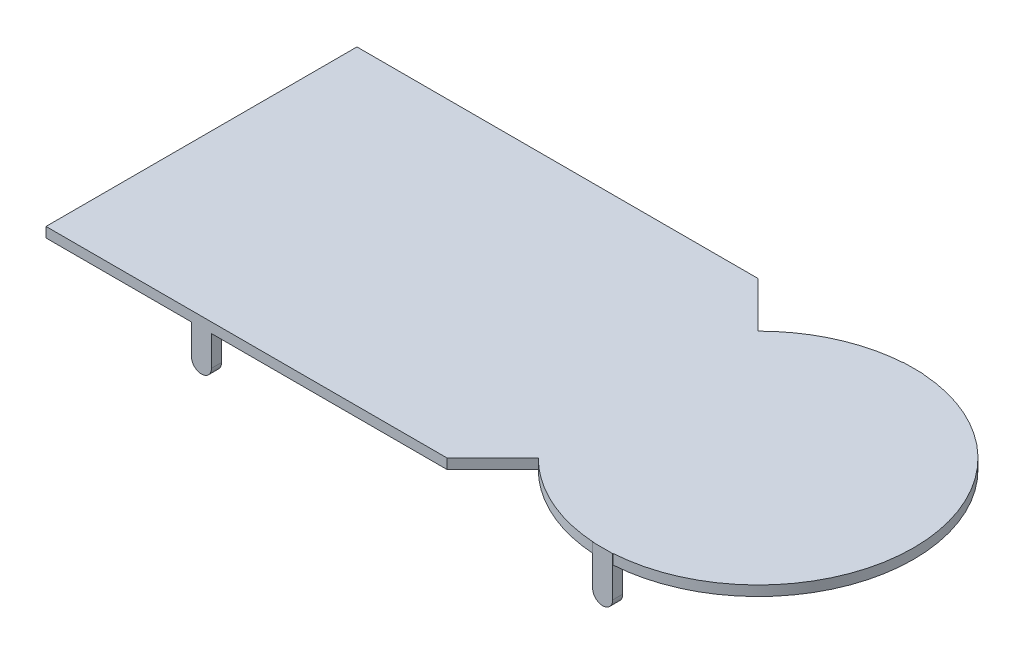
ISO-10303-21;
HEADER;
FILE_DESCRIPTION(('STEP AP214'),'2;1');
FILE_NAME('part.step','',(''),(''),'','','');
FILE_SCHEMA(('AUTOMOTIVE_DESIGN { 1 0 10303 214 1 1 1 1 }'));
ENDSEC;
DATA;
#1=APPLICATION_CONTEXT('core data for automotive mechanical design processes');
#2=APPLICATION_PROTOCOL_DEFINITION('international standard','automotive_design',2000,#1);
#3=PRODUCT_CONTEXT('',#1,'mechanical');
#4=PRODUCT('Part','Part','',(#3));
#5=PRODUCT_RELATED_PRODUCT_CATEGORY('part','',(#4));
#6=PRODUCT_DEFINITION_FORMATION('','',#4);
#7=PRODUCT_DEFINITION_CONTEXT('part definition',#1,'design');
#8=PRODUCT_DEFINITION('design','',#6,#7);
#9=PRODUCT_DEFINITION_SHAPE('','',#8);
#10=(LENGTH_UNIT() NAMED_UNIT(*) SI_UNIT(.MILLI.,.METRE.));
#11=(NAMED_UNIT(*) PLANE_ANGLE_UNIT() SI_UNIT($,.RADIAN.));
#12=(NAMED_UNIT(*) SI_UNIT($,.STERADIAN.) SOLID_ANGLE_UNIT());
#13=UNCERTAINTY_MEASURE_WITH_UNIT(LENGTH_MEASURE(1.E-05),#10,'distance_accuracy_value','');
#14=(GEOMETRIC_REPRESENTATION_CONTEXT(3) GLOBAL_UNCERTAINTY_ASSIGNED_CONTEXT((#13)) GLOBAL_UNIT_ASSIGNED_CONTEXT((#10,
#11,#12)) REPRESENTATION_CONTEXT('',''));
#15=CARTESIAN_POINT('',(0.,0.,0.));
#16=DIRECTION('',(0.,0.,1.));
#17=DIRECTION('',(1.,0.,0.));
#18=AXIS2_PLACEMENT_3D('',#15,#16,#17);
#19=CARTESIAN_POINT('',(-35.,10.,-155.));
#20=DIRECTION('',(1.,0.,0.));
#21=DIRECTION('',(0.,0.,-1.));
#22=AXIS2_PLACEMENT_3D('',#19,#20,#21);
#23=PLANE('',#22);
#24=DIRECTION('',(0.,-1.,0.));
#25=VECTOR('',#24,1.);
#26=CARTESIAN_POINT('',(-35.,10.,145.));
#27=LINE('',#26,#25);
#28=CARTESIAN_POINT('',(-34.9999999999998,0.,145.));
#29=VERTEX_POINT('',#28);
#30=CARTESIAN_POINT('',(-35.,-30.,145.));
#31=VERTEX_POINT('',#30);
#32=EDGE_CURVE('E273',#29,#31,#27,.T.);
#33=ORIENTED_EDGE('',*,*,#32,.F.);
#34=DIRECTION('',(0.,0.,-1.));
#35=VECTOR('',#34,1.);
#36=CARTESIAN_POINT('',(-35.,0.,0.));
#37=LINE('',#36,#35);
#38=CARTESIAN_POINT('',(-35.,0.,155.));
#39=VERTEX_POINT('',#38);
#40=EDGE_CURVE('E218',#39,#29,#37,.T.);
#41=ORIENTED_EDGE('',*,*,#40,.F.);
#42=DIRECTION('',(0.,1.,0.));
#43=VECTOR('',#42,1.);
#44=CARTESIAN_POINT('',(-35.,10.,155.));
#45=LINE('',#44,#43);
#46=CARTESIAN_POINT('',(-35.,-30.,155.));
#47=VERTEX_POINT('',#46);
#48=EDGE_CURVE('E315',#47,#39,#45,.T.);
#49=ORIENTED_EDGE('',*,*,#48,.F.);
#50=DIRECTION('',(0.,0.,1.));
#51=VECTOR('',#50,1.);
#52=CARTESIAN_POINT('',(-35.,-30.,-155.));
#53=LINE('',#52,#51);
#54=EDGE_CURVE('E334',#31,#47,#53,.T.);
#55=ORIENTED_EDGE('',*,*,#54,.F.);
#56=EDGE_LOOP('',(#33,#41,#49,#55));
#57=FACE_BOUND('',#56,.T.);
#58=ADVANCED_FACE('F37',(#57),#23,.T.);
#59=CARTESIAN_POINT('',(-55.,10.,-155.));
#60=DIRECTION('',(-1.,0.,0.));
#61=DIRECTION('',(0.,0.,1.));
#62=AXIS2_PLACEMENT_3D('',#59,#60,#61);
#63=PLANE('',#62);
#64=DIRECTION('',(0.,1.,0.));
#65=VECTOR('',#64,1.);
#66=CARTESIAN_POINT('',(-55.,-40.,145.));
#67=LINE('',#66,#65);
#68=CARTESIAN_POINT('',(-55.,-30.,145.));
#69=VERTEX_POINT('',#68);
#70=CARTESIAN_POINT('',(-55.,0.,145.));
#71=VERTEX_POINT('',#70);
#72=EDGE_CURVE('E225',#69,#71,#67,.T.);
#73=ORIENTED_EDGE('',*,*,#72,.F.);
#74=DIRECTION('',(0.,0.,1.));
#75=VECTOR('',#74,1.);
#76=CARTESIAN_POINT('',(-55.,-30.,-155.));
#77=LINE('',#76,#75);
#78=CARTESIAN_POINT('',(-55.,-30.,155.));
#79=VERTEX_POINT('',#78);
#80=EDGE_CURVE('E325',#69,#79,#77,.T.);
#81=ORIENTED_EDGE('',*,*,#80,.T.);
#82=DIRECTION('',(0.,-1.,0.));
#83=VECTOR('',#82,1.);
#84=CARTESIAN_POINT('',(-55.,10.,155.));
#85=LINE('',#84,#83);
#86=CARTESIAN_POINT('',(-55.,0.,155.));
#87=VERTEX_POINT('',#86);
#88=EDGE_CURVE('E234',#87,#79,#85,.T.);
#89=ORIENTED_EDGE('',*,*,#88,.F.);
#90=DIRECTION('',(0.,0.,1.));
#91=VECTOR('',#90,1.);
#92=CARTESIAN_POINT('',(-55.,0.,0.));
#93=LINE('',#92,#91);
#94=EDGE_CURVE('E214',#71,#87,#93,.T.);
#95=ORIENTED_EDGE('',*,*,#94,.F.);
#96=EDGE_LOOP('',(#73,#81,#89,#95));
#97=FACE_BOUND('',#96,.T.);
#98=ADVANCED_FACE('F232',(#97),#63,.T.);
#99=CARTESIAN_POINT('',(-45.,-30.,-155.));
#100=DIRECTION('',(0.,0.,1.));
#101=DIRECTION('',(1.,0.,0.));
#102=AXIS2_PLACEMENT_3D('',#99,#100,#101);
#103=CYLINDRICAL_SURFACE('',#102,10.);
#104=ORIENTED_EDGE('',*,*,#80,.F.);
#105=CARTESIAN_POINT('',(-45.,-30.,145.));
#106=DIRECTION('',(0.,0.,1.));
#107=DIRECTION('',(1.,0.,0.));
#108=AXIS2_PLACEMENT_3D('',#105,#106,#107);
#109=CIRCLE('',#108,10.);
#110=EDGE_CURVE('E228',#31,#69,#109,.F.);
#111=ORIENTED_EDGE('',*,*,#110,.F.);
#112=ORIENTED_EDGE('',*,*,#54,.T.);
#113=CARTESIAN_POINT('',(-45.,-30.,155.));
#114=DIRECTION('',(0.,0.,1.));
#115=DIRECTION('',(1.,0.,0.));
#116=AXIS2_PLACEMENT_3D('',#113,#114,#115);
#117=CIRCLE('',#116,10.);
#118=EDGE_CURVE('E320',#79,#47,#117,.T.);
#119=ORIENTED_EDGE('',*,*,#118,.F.);
#120=EDGE_LOOP('',(#104,#111,#112,#119));
#121=FACE_BOUND('',#120,.T.);
#122=ADVANCED_FACE('F468',(#121),#103,.T.);
#123=CARTESIAN_POINT('',(364.999999999997,10.,-155.));
#124=DIRECTION('',(1.,0.,0.));
#125=DIRECTION('',(0.,1.,0.));
#126=AXIS2_PLACEMENT_3D('',#123,#124,#125);
#127=PLANE('',#126);
#128=DIRECTION('',(0.,-1.,0.));
#129=VECTOR('',#128,1.);
#130=CARTESIAN_POINT('',(364.999999999997,10.,145.));
#131=LINE('',#130,#129);
#132=CARTESIAN_POINT('',(364.999999999997,0.,145.));
#133=VERTEX_POINT('',#132);
#134=CARTESIAN_POINT('',(364.999999999997,-30.,145.));
#135=VERTEX_POINT('',#134);
#136=EDGE_CURVE('E418',#133,#135,#131,.T.);
#137=ORIENTED_EDGE('',*,*,#136,.F.);
#138=DIRECTION('',(0.,0.,-1.));
#139=VECTOR('',#138,1.);
#140=CARTESIAN_POINT('',(364.999999999997,0.,0.));
#141=LINE('',#140,#139);
#142=CARTESIAN_POINT('',(364.999999999997,0.,154.677082982579));
#143=VERTEX_POINT('',#142);
#144=EDGE_CURVE('E309',#143,#133,#141,.T.);
#145=ORIENTED_EDGE('',*,*,#144,.F.);
#146=DIRECTION('',(0.,-1.,0.));
#147=VECTOR('',#146,1.);
#148=CARTESIAN_POINT('',(364.999999999997,9.99999999999999,154.677082982579));
#149=LINE('',#148,#147);
#150=CARTESIAN_POINT('',(364.999999999997,10.,154.677082982579));
#151=VERTEX_POINT('',#150);
#152=EDGE_CURVE('E312',#151,#143,#149,.T.);
#153=ORIENTED_EDGE('',*,*,#152,.F.);
#154=DIRECTION('',(0.,0.,1.));
#155=VECTOR('',#154,1.);
#156=CARTESIAN_POINT('',(364.999999999997,10.,-155.));
#157=LINE('',#156,#155);
#158=CARTESIAN_POINT('',(364.999999999997,10.,155.));
#159=VERTEX_POINT('',#158);
#160=EDGE_CURVE('E422',#151,#159,#157,.T.);
#161=ORIENTED_EDGE('',*,*,#160,.T.);
#162=DIRECTION('',(0.,1.,0.));
#163=VECTOR('',#162,1.);
#164=CARTESIAN_POINT('',(364.999999999997,10.,155.));
#165=LINE('',#164,#163);
#166=CARTESIAN_POINT('',(364.999999999997,-30.,155.));
#167=VERTEX_POINT('',#166);
#168=EDGE_CURVE('E285',#167,#159,#165,.T.);
#169=ORIENTED_EDGE('',*,*,#168,.F.);
#170=DIRECTION('',(0.,0.,1.));
#171=VECTOR('',#170,1.);
#172=CARTESIAN_POINT('',(364.999999999997,-30.,-155.));
#173=LINE('',#172,#171);
#174=EDGE_CURVE('E269',#135,#167,#173,.T.);
#175=ORIENTED_EDGE('',*,*,#174,.F.);
#176=EDGE_LOOP('',(#137,#145,#153,#161,#169,#175));
#177=FACE_BOUND('',#176,.T.);
#178=ADVANCED_FACE('F500',(#177),#127,.T.);
#179=CARTESIAN_POINT('',(344.999999999996,10.,-155.));
#180=DIRECTION('',(-1.,0.,0.));
#181=DIRECTION('',(0.,-1.,0.));
#182=AXIS2_PLACEMENT_3D('',#179,#180,#181);
#183=PLANE('',#182);
#184=DIRECTION('',(0.,1.,0.));
#185=VECTOR('',#184,1.);
#186=CARTESIAN_POINT('',(344.999999999996,10.,145.));
#187=LINE('',#186,#185);
#188=CARTESIAN_POINT('',(344.999999999997,-30.,145.));
#189=VERTEX_POINT('',#188);
#190=CARTESIAN_POINT('',(344.999999999997,0.,145.));
#191=VERTEX_POINT('',#190);
#192=EDGE_CURVE('E416',#189,#191,#187,.T.);
#193=ORIENTED_EDGE('',*,*,#192,.F.);
#194=DIRECTION('',(0.,0.,1.));
#195=VECTOR('',#194,1.);
#196=CARTESIAN_POINT('',(344.999999999997,-30.,-155.));
#197=LINE('',#196,#195);
#198=CARTESIAN_POINT('',(344.999999999997,-30.,155.));
#199=VERTEX_POINT('',#198);
#200=EDGE_CURVE('E268',#189,#199,#197,.T.);
#201=ORIENTED_EDGE('',*,*,#200,.T.);
#202=DIRECTION('',(0.,-1.,0.));
#203=VECTOR('',#202,1.);
#204=CARTESIAN_POINT('',(344.999999999996,10.,155.));
#205=LINE('',#204,#203);
#206=CARTESIAN_POINT('',(344.999999999996,10.,155.));
#207=VERTEX_POINT('',#206);
#208=EDGE_CURVE('E279',#207,#199,#205,.T.);
#209=ORIENTED_EDGE('',*,*,#208,.F.);
#210=DIRECTION('',(0.,0.,1.));
#211=VECTOR('',#210,1.);
#212=CARTESIAN_POINT('',(344.999999999996,10.,-155.));
#213=LINE('',#212,#211);
#214=CARTESIAN_POINT('',(344.999999999996,10.,154.677082982578));
#215=VERTEX_POINT('',#214);
#216=EDGE_CURVE('E423',#215,#207,#213,.T.);
#217=ORIENTED_EDGE('',*,*,#216,.F.);
#218=DIRECTION('',(0.,-1.,0.));
#219=VECTOR('',#218,1.);
#220=CARTESIAN_POINT('',(344.999999999996,9.99999999999999,154.677082982578));
#221=LINE('',#220,#219);
#222=CARTESIAN_POINT('',(344.999999999996,0.,154.677082982578));
#223=VERTEX_POINT('',#222);
#224=EDGE_CURVE('E288',#223,#215,#221,.F.);
#225=ORIENTED_EDGE('',*,*,#224,.F.);
#226=DIRECTION('',(0.,0.,1.));
#227=VECTOR('',#226,1.);
#228=CARTESIAN_POINT('',(344.999999999996,0.,0.));
#229=LINE('',#228,#227);
#230=EDGE_CURVE('E299',#191,#223,#229,.T.);
#231=ORIENTED_EDGE('',*,*,#230,.F.);
#232=EDGE_LOOP('',(#193,#201,#209,#217,#225,#231));
#233=FACE_BOUND('',#232,.T.);
#234=ADVANCED_FACE('F488',(#233),#183,.T.);
#235=CARTESIAN_POINT('',(354.999999999997,-30.,-155.));
#236=DIRECTION('',(0.,0.,1.));
#237=DIRECTION('',(1.,0.,0.));
#238=AXIS2_PLACEMENT_3D('',#235,#236,#237);
#239=CYLINDRICAL_SURFACE('',#238,10.);
#240=ORIENTED_EDGE('',*,*,#200,.F.);
#241=CARTESIAN_POINT('',(354.999999999997,-30.,145.));
#242=DIRECTION('',(0.,0.,1.));
#243=DIRECTION('',(1.,0.,0.));
#244=AXIS2_PLACEMENT_3D('',#241,#242,#243);
#245=CIRCLE('',#244,10.);
#246=EDGE_CURVE('E11',#135,#189,#245,.F.);
#247=ORIENTED_EDGE('',*,*,#246,.F.);
#248=ORIENTED_EDGE('',*,*,#174,.T.);
#249=CARTESIAN_POINT('',(354.999999999997,-30.,155.));
#250=DIRECTION('',(0.,0.,1.));
#251=DIRECTION('',(1.,0.,0.));
#252=AXIS2_PLACEMENT_3D('',#249,#250,#251);
#253=CIRCLE('',#252,10.);
#254=EDGE_CURVE('E276',#199,#167,#253,.T.);
#255=ORIENTED_EDGE('',*,*,#254,.F.);
#256=EDGE_LOOP('',(#240,#247,#248,#255));
#257=FACE_BOUND('',#256,.T.);
#258=ADVANCED_FACE('F494',(#257),#239,.T.);
#259=CARTESIAN_POINT('',(354.999999999998,10.,0.));
#260=DIRECTION('',(0.,-1.,0.));
#261=DIRECTION('',(0.,0.,-1.));
#262=AXIS2_PLACEMENT_3D('',#259,#260,#261);
#263=CYLINDRICAL_SURFACE('',#262,154.999999999998);
#264=CARTESIAN_POINT('',(354.999999999998,10.,0.));
#265=DIRECTION('',(0.,1.,0.));
#266=DIRECTION('',(0.,0.,1.));
#267=AXIS2_PLACEMENT_3D('',#264,#265,#266);
#268=CIRCLE('',#267,154.999999999998);
#269=CARTESIAN_POINT('',(364.999999999997,10.,-154.677082982579));
#270=VERTEX_POINT('',#269);
#271=EDGE_CURVE('E352',#151,#270,#268,.T.);
#272=ORIENTED_EDGE('',*,*,#271,.F.);
#273=ORIENTED_EDGE('',*,*,#152,.T.);
#274=CARTESIAN_POINT('',(354.999999999998,0.,0.));
#275=DIRECTION('',(0.,1.,0.));
#276=DIRECTION('',(0.,0.,1.));
#277=AXIS2_PLACEMENT_3D('',#274,#275,#276);
#278=CIRCLE('',#277,154.999999999998);
#279=CARTESIAN_POINT('',(364.999999999997,0.,-154.677082982579));
#280=VERTEX_POINT('',#279);
#281=EDGE_CURVE('E368',#143,#280,#278,.T.);
#282=ORIENTED_EDGE('',*,*,#281,.T.);
#283=DIRECTION('',(0.,-1.,0.));
#284=VECTOR('',#283,1.);
#285=CARTESIAN_POINT('',(364.999999999997,9.99999999999999,-154.677082982579));
#286=LINE('',#285,#284);
#287=EDGE_CURVE('E306',#280,#270,#286,.F.);
#288=ORIENTED_EDGE('',*,*,#287,.T.);
#289=EDGE_LOOP('',(#272,#273,#282,#288));
#290=FACE_BOUND('',#289,.T.);
#291=ADVANCED_FACE('F436',(#290),#263,.T.);
#292=CARTESIAN_POINT('',(245.398448916085,0.,109.601551083914));
#293=VERTEX_POINT('',#292);
#294=EDGE_CURVE('E366',#293,#223,#278,.T.);
#295=ORIENTED_EDGE('',*,*,#294,.T.);
#296=ORIENTED_EDGE('',*,*,#224,.T.);
#297=CARTESIAN_POINT('',(245.398448916085,10.,109.601551083914));
#298=VERTEX_POINT('',#297);
#299=EDGE_CURVE('E348',#298,#215,#268,.T.);
#300=ORIENTED_EDGE('',*,*,#299,.F.);
#301=DIRECTION('',(0.,-1.,0.));
#302=VECTOR('',#301,1.);
#303=CARTESIAN_POINT('',(245.398448916085,10.,109.601551083914));
#304=LINE('',#303,#302);
#305=EDGE_CURVE('E375',#298,#293,#304,.T.);
#306=ORIENTED_EDGE('',*,*,#305,.T.);
#307=EDGE_LOOP('',(#295,#296,#300,#306));
#308=FACE_BOUND('',#307,.T.);
#309=ADVANCED_FACE('F484',(#308),#263,.T.);
#310=CARTESIAN_POINT('',(-200.,10.,-155.));
#311=DIRECTION('',(0.,0.,1.));
#312=DIRECTION('',(1.,0.,0.));
#313=AXIS2_PLACEMENT_3D('',#310,#311,#312);
#314=PLANE('',#313);
#315=DIRECTION('',(0.,-1.,0.));
#316=VECTOR('',#315,1.);
#317=CARTESIAN_POINT('',(-200.,10.,-155.));
#318=LINE('',#317,#316);
#319=CARTESIAN_POINT('',(-200.,10.,-155.));
#320=VERTEX_POINT('',#319);
#321=CARTESIAN_POINT('',(-200.,0.,-155.));
#322=VERTEX_POINT('',#321);
#323=EDGE_CURVE('E237',#320,#322,#318,.T.);
#324=ORIENTED_EDGE('',*,*,#323,.F.);
#325=DIRECTION('',(-1.,0.,0.));
#326=VECTOR('',#325,1.);
#327=CARTESIAN_POINT('',(-200.,10.,-155.));
#328=LINE('',#327,#326);
#329=CARTESIAN_POINT('',(200.,10.,-155.));
#330=VERTEX_POINT('',#329);
#331=EDGE_CURVE('E338',#330,#320,#328,.T.);
#332=ORIENTED_EDGE('',*,*,#331,.F.);
#333=DIRECTION('',(0.,-1.,0.));
#334=VECTOR('',#333,1.);
#335=CARTESIAN_POINT('',(200.,10.,-155.));
#336=LINE('',#335,#334);
#337=CARTESIAN_POINT('',(200.,0.,-155.));
#338=VERTEX_POINT('',#337);
#339=EDGE_CURVE('E354',#330,#338,#336,.T.);
#340=ORIENTED_EDGE('',*,*,#339,.T.);
#341=DIRECTION('',(-1.,0.,0.));
#342=VECTOR('',#341,1.);
#343=CARTESIAN_POINT('',(-200.,0.,-155.));
#344=LINE('',#343,#342);
#345=CARTESIAN_POINT('',(-35.,0.,-155.));
#346=VERTEX_POINT('',#345);
#347=EDGE_CURVE('E355',#338,#346,#344,.T.);
#348=ORIENTED_EDGE('',*,*,#347,.T.);
#349=DIRECTION('',(0.,1.,0.));
#350=VECTOR('',#349,1.);
#351=CARTESIAN_POINT('',(-35.,10.,-155.));
#352=LINE('',#351,#350);
#353=CARTESIAN_POINT('',(-35.,-30.,-155.));
#354=VERTEX_POINT('',#353);
#355=EDGE_CURVE('E316',#354,#346,#352,.T.);
#356=ORIENTED_EDGE('',*,*,#355,.F.);
#357=CARTESIAN_POINT('',(-45.,-30.,-155.));
#358=DIRECTION('',(0.,0.,1.));
#359=DIRECTION('',(1.,0.,0.));
#360=AXIS2_PLACEMENT_3D('',#357,#358,#359);
#361=CIRCLE('',#360,10.);
#362=CARTESIAN_POINT('',(-55.,-30.,-155.));
#363=VERTEX_POINT('',#362);
#364=EDGE_CURVE('E322',#363,#354,#361,.T.);
#365=ORIENTED_EDGE('',*,*,#364,.F.);
#366=DIRECTION('',(0.,-1.,0.));
#367=VECTOR('',#366,1.);
#368=CARTESIAN_POINT('',(-55.,10.,-155.));
#369=LINE('',#368,#367);
#370=CARTESIAN_POINT('',(-55.,0.,-155.));
#371=VERTEX_POINT('',#370);
#372=EDGE_CURVE('E319',#371,#363,#369,.T.);
#373=ORIENTED_EDGE('',*,*,#372,.F.);
#374=EDGE_CURVE('E333',#371,#322,#344,.T.);
#375=ORIENTED_EDGE('',*,*,#374,.T.);
#376=EDGE_LOOP('',(#324,#332,#340,#348,#356,#365,#373,#375));
#377=FACE_BOUND('',#376,.T.);
#378=ADVANCED_FACE('F39',(#377),#314,.F.);
#379=CARTESIAN_POINT('',(-200.,10.,155.));
#380=DIRECTION('',(1.,0.,0.));
#381=DIRECTION('',(0.,0.,-1.));
#382=AXIS2_PLACEMENT_3D('',#379,#380,#381);
#383=PLANE('',#382);
#384=DIRECTION('',(0.,0.,1.));
#385=VECTOR('',#384,1.);
#386=CARTESIAN_POINT('',(-200.,0.,155.));
#387=LINE('',#386,#385);
#388=CARTESIAN_POINT('',(-200.,0.,155.));
#389=VERTEX_POINT('',#388);
#390=EDGE_CURVE('E358',#322,#389,#387,.T.);
#391=ORIENTED_EDGE('',*,*,#390,.T.);
#392=DIRECTION('',(0.,-1.,0.));
#393=VECTOR('',#392,1.);
#394=CARTESIAN_POINT('',(-200.,10.,155.));
#395=LINE('',#394,#393);
#396=CARTESIAN_POINT('',(-200.,10.,155.));
#397=VERTEX_POINT('',#396);
#398=EDGE_CURVE('E242',#397,#389,#395,.T.);
#399=ORIENTED_EDGE('',*,*,#398,.F.);
#400=DIRECTION('',(0.,0.,1.));
#401=VECTOR('',#400,1.);
#402=CARTESIAN_POINT('',(-200.,10.,155.));
#403=LINE('',#402,#401);
#404=EDGE_CURVE('E340',#320,#397,#403,.T.);
#405=ORIENTED_EDGE('',*,*,#404,.F.);
#406=ORIENTED_EDGE('',*,*,#323,.T.);
#407=EDGE_LOOP('',(#391,#399,#405,#406));
#408=FACE_BOUND('',#407,.T.);
#409=ADVANCED_FACE('F390',(#408),#383,.F.);
#410=CARTESIAN_POINT('',(-200.,10.,155.));
#411=DIRECTION('',(0.,0.,-1.));
#412=DIRECTION('',(-1.,0.,0.));
#413=AXIS2_PLACEMENT_3D('',#410,#411,#412);
#414=PLANE('',#413);
#415=DIRECTION('',(1.,0.,0.));
#416=VECTOR('',#415,1.);
#417=CARTESIAN_POINT('',(-200.,0.,155.));
#418=LINE('',#417,#416);
#419=EDGE_CURVE('E361',#389,#87,#418,.T.);
#420=ORIENTED_EDGE('',*,*,#419,.T.);
#421=ORIENTED_EDGE('',*,*,#88,.T.);
#422=ORIENTED_EDGE('',*,*,#118,.T.);
#423=ORIENTED_EDGE('',*,*,#48,.T.);
#424=CARTESIAN_POINT('',(200.,0.,155.));
#425=VERTEX_POINT('',#424);
#426=EDGE_CURVE('E360',#39,#425,#418,.T.);
#427=ORIENTED_EDGE('',*,*,#426,.T.);
#428=DIRECTION('',(0.,-1.,0.));
#429=VECTOR('',#428,1.);
#430=CARTESIAN_POINT('',(200.,10.,155.));
#431=LINE('',#430,#429);
#432=CARTESIAN_POINT('',(200.,10.,155.));
#433=VERTEX_POINT('',#432);
#434=EDGE_CURVE('E378',#433,#425,#431,.T.);
#435=ORIENTED_EDGE('',*,*,#434,.F.);
#436=DIRECTION('',(1.,0.,0.));
#437=VECTOR('',#436,1.);
#438=CARTESIAN_POINT('',(-200.,10.,155.));
#439=LINE('',#438,#437);
#440=EDGE_CURVE('E343',#397,#433,#439,.T.);
#441=ORIENTED_EDGE('',*,*,#440,.F.);
#442=ORIENTED_EDGE('',*,*,#398,.T.);
#443=EDGE_LOOP('',(#420,#421,#422,#423,#427,#435,#441,#442));
#444=FACE_BOUND('',#443,.T.);
#445=ADVANCED_FACE('F384',(#444),#414,.F.);
#446=CARTESIAN_POINT('',(245.398448916085,10.,109.601551083914));
#447=DIRECTION('',(-0.707106781186551,0.,-0.707106781186544));
#448=DIRECTION('',(-0.707106781186544,0.,0.707106781186551));
#449=AXIS2_PLACEMENT_3D('',#446,#447,#448);
#450=PLANE('',#449);
#451=DIRECTION('',(0.707106781186544,0.,-0.707106781186551));
#452=VECTOR('',#451,1.);
#453=CARTESIAN_POINT('',(245.398448916085,0.,109.601551083914));
#454=LINE('',#453,#452);
#455=EDGE_CURVE('E363',#425,#293,#454,.T.);
#456=ORIENTED_EDGE('',*,*,#455,.T.);
#457=ORIENTED_EDGE('',*,*,#305,.F.);
#458=DIRECTION('',(0.707106781186544,0.,-0.707106781186551));
#459=VECTOR('',#458,1.);
#460=CARTESIAN_POINT('',(245.398448916085,10.,109.601551083914));
#461=LINE('',#460,#459);
#462=EDGE_CURVE('E345',#433,#298,#461,.T.);
#463=ORIENTED_EDGE('',*,*,#462,.F.);
#464=ORIENTED_EDGE('',*,*,#434,.T.);
#465=EDGE_LOOP('',(#456,#457,#463,#464));
#466=FACE_BOUND('',#465,.T.);
#467=ADVANCED_FACE('F476',(#466),#450,.F.);
#468=CARTESIAN_POINT('',(344.999999999996,10.,-154.677082982578));
#469=VERTEX_POINT('',#468);
#470=CARTESIAN_POINT('',(245.398448916085,10.,-109.601551083914));
#471=VERTEX_POINT('',#470);
#472=EDGE_CURVE('E347',#469,#471,#268,.T.);
#473=ORIENTED_EDGE('',*,*,#472,.F.);
#474=DIRECTION('',(0.,-1.,0.));
#475=VECTOR('',#474,1.);
#476=CARTESIAN_POINT('',(344.999999999996,9.99999999999999,-154.677082982578));
#477=LINE('',#476,#475);
#478=CARTESIAN_POINT('',(344.999999999996,0.,-154.677082982578));
#479=VERTEX_POINT('',#478);
#480=EDGE_CURVE('E303',#469,#479,#477,.T.);
#481=ORIENTED_EDGE('',*,*,#480,.T.);
#482=CARTESIAN_POINT('',(245.398448916085,0.,-109.601551083914));
#483=VERTEX_POINT('',#482);
#484=EDGE_CURVE('E365',#479,#483,#278,.T.);
#485=ORIENTED_EDGE('',*,*,#484,.T.);
#486=DIRECTION('',(0.,-1.,0.));
#487=VECTOR('',#486,1.);
#488=CARTESIAN_POINT('',(245.398448916085,10.,-109.601551083914));
#489=LINE('',#488,#487);
#490=EDGE_CURVE('E372',#471,#483,#489,.T.);
#491=ORIENTED_EDGE('',*,*,#490,.F.);
#492=EDGE_LOOP('',(#473,#481,#485,#491));
#493=FACE_BOUND('',#492,.T.);
#494=ADVANCED_FACE('F445',(#493),#263,.T.);
#495=CARTESIAN_POINT('',(200.,10.,-155.));
#496=DIRECTION('',(-0.707106781186552,0.,0.707106781186543));
#497=DIRECTION('',(0.707106781186543,0.,0.707106781186552));
#498=AXIS2_PLACEMENT_3D('',#495,#496,#497);
#499=PLANE('',#498);
#500=DIRECTION('',(-0.707106781186543,0.,-0.707106781186552));
#501=VECTOR('',#500,1.);
#502=CARTESIAN_POINT('',(200.,0.,-155.));
#503=LINE('',#502,#501);
#504=EDGE_CURVE('E341',#483,#338,#503,.T.);
#505=ORIENTED_EDGE('',*,*,#504,.T.);
#506=ORIENTED_EDGE('',*,*,#339,.F.);
#507=DIRECTION('',(-0.707106781186543,0.,-0.707106781186552));
#508=VECTOR('',#507,1.);
#509=CARTESIAN_POINT('',(200.,10.,-155.));
#510=LINE('',#509,#508);
#511=EDGE_CURVE('E351',#471,#330,#510,.T.);
#512=ORIENTED_EDGE('',*,*,#511,.F.);
#513=ORIENTED_EDGE('',*,*,#490,.T.);
#514=EDGE_LOOP('',(#505,#506,#512,#513));
#515=FACE_BOUND('',#514,.T.);
#516=ADVANCED_FACE('F449',(#515),#499,.F.);
#517=CARTESIAN_POINT('',(354.999999999998,10.,0.));
#518=DIRECTION('',(0.,1.,0.));
#519=DIRECTION('',(0.,0.,1.));
#520=AXIS2_PLACEMENT_3D('',#517,#518,#519);
#521=PLANE('',#520);
#522=ORIENTED_EDGE('',*,*,#299,.T.);
#523=ORIENTED_EDGE('',*,*,#216,.T.);
#524=DIRECTION('',(-1.,0.,0.));
#525=VECTOR('',#524,1.);
#526=CARTESIAN_POINT('',(364.999999999997,10.,155.));
#527=LINE('',#526,#525);
#528=EDGE_CURVE('E283',#159,#207,#527,.T.);
#529=ORIENTED_EDGE('',*,*,#528,.F.);
#530=ORIENTED_EDGE('',*,*,#160,.F.);
#531=ORIENTED_EDGE('',*,*,#271,.T.);
#532=CARTESIAN_POINT('',(364.999999999997,10.,-155.));
#533=VERTEX_POINT('',#532);
#534=EDGE_CURVE('E291',#533,#270,#157,.T.);
#535=ORIENTED_EDGE('',*,*,#534,.F.);
#536=DIRECTION('',(-1.,0.,0.));
#537=VECTOR('',#536,1.);
#538=CARTESIAN_POINT('',(364.999999999997,10.,-155.));
#539=LINE('',#538,#537);
#540=CARTESIAN_POINT('',(344.999999999996,10.,-155.));
#541=VERTEX_POINT('',#540);
#542=EDGE_CURVE('E294',#533,#541,#539,.T.);
#543=ORIENTED_EDGE('',*,*,#542,.T.);
#544=EDGE_CURVE('E60',#541,#469,#213,.T.);
#545=ORIENTED_EDGE('',*,*,#544,.T.);
#546=ORIENTED_EDGE('',*,*,#472,.T.);
#547=ORIENTED_EDGE('',*,*,#511,.T.);
#548=ORIENTED_EDGE('',*,*,#331,.T.);
#549=ORIENTED_EDGE('',*,*,#404,.T.);
#550=ORIENTED_EDGE('',*,*,#440,.T.);
#551=ORIENTED_EDGE('',*,*,#462,.T.);
#552=EDGE_LOOP('',(#522,#523,#529,#530,#531,#535,#543,#545,#546,#547,#548,#549,#550,#551));
#553=FACE_BOUND('',#552,.T.);
#554=ADVANCED_FACE('F439',(#553),#521,.T.);
#555=CARTESIAN_POINT('',(354.999999999998,0.,0.));
#556=DIRECTION('',(0.,1.,0.));
#557=DIRECTION('',(0.,0.,1.));
#558=AXIS2_PLACEMENT_3D('',#555,#556,#557);
#559=PLANE('',#558);
#560=ORIENTED_EDGE('',*,*,#374,.F.);
#561=CARTESIAN_POINT('',(-55.,0.,-145.));
#562=VERTEX_POINT('',#561);
#563=EDGE_CURVE('E236',#371,#562,#93,.T.);
#564=ORIENTED_EDGE('',*,*,#563,.T.);
#565=DIRECTION('',(-1.,0.,0.));
#566=VECTOR('',#565,1.);
#567=CARTESIAN_POINT('',(534.,0.,-145.));
#568=LINE('',#567,#566);
#569=CARTESIAN_POINT('',(-34.9999999999998,0.,-145.));
#570=VERTEX_POINT('',#569);
#571=EDGE_CURVE('E409',#570,#562,#568,.T.);
#572=ORIENTED_EDGE('',*,*,#571,.F.);
#573=EDGE_CURVE('E240',#570,#346,#37,.T.);
#574=ORIENTED_EDGE('',*,*,#573,.T.);
#575=ORIENTED_EDGE('',*,*,#347,.F.);
#576=ORIENTED_EDGE('',*,*,#504,.F.);
#577=ORIENTED_EDGE('',*,*,#484,.F.);
#578=CARTESIAN_POINT('',(344.999999999997,0.,-145.));
#579=VERTEX_POINT('',#578);
#580=EDGE_CURVE('E300',#479,#579,#229,.T.);
#581=ORIENTED_EDGE('',*,*,#580,.T.);
#582=CARTESIAN_POINT('',(364.999999999997,0.,-145.));
#583=VERTEX_POINT('',#582);
#584=EDGE_CURVE('E412',#583,#579,#568,.T.);
#585=ORIENTED_EDGE('',*,*,#584,.F.);
#586=EDGE_CURVE('E261',#583,#280,#141,.T.);
#587=ORIENTED_EDGE('',*,*,#586,.T.);
#588=ORIENTED_EDGE('',*,*,#281,.F.);
#589=ORIENTED_EDGE('',*,*,#144,.T.);
#590=DIRECTION('',(-1.,0.,0.));
#591=VECTOR('',#590,1.);
#592=CARTESIAN_POINT('',(534.,0.,145.));
#593=LINE('',#592,#591);
#594=EDGE_CURVE('E221',#133,#191,#593,.T.);
#595=ORIENTED_EDGE('',*,*,#594,.T.);
#596=ORIENTED_EDGE('',*,*,#230,.T.);
#597=ORIENTED_EDGE('',*,*,#294,.F.);
#598=ORIENTED_EDGE('',*,*,#455,.F.);
#599=ORIENTED_EDGE('',*,*,#426,.F.);
#600=ORIENTED_EDGE('',*,*,#40,.T.);
#601=EDGE_CURVE('E208',#29,#71,#593,.T.);
#602=ORIENTED_EDGE('',*,*,#601,.T.);
#603=ORIENTED_EDGE('',*,*,#94,.T.);
#604=ORIENTED_EDGE('',*,*,#419,.F.);
#605=ORIENTED_EDGE('',*,*,#390,.F.);
#606=EDGE_LOOP('',(#560,#564,#572,#574,#575,#576,#577,#581,#585,#587,#588,#589,#595,#596,#597,
#598,#599,#600,#602,#603,#604,#605));
#607=FACE_BOUND('',#606,.T.);
#608=ADVANCED_FACE('F211',(#607),#559,.F.);
#609=DIRECTION('',(0.,1.,0.));
#610=VECTOR('',#609,1.);
#611=CARTESIAN_POINT('',(-35.,10.,-145.));
#612=LINE('',#611,#610);
#613=CARTESIAN_POINT('',(-35.,-30.,-145.));
#614=VERTEX_POINT('',#613);
#615=EDGE_CURVE('E405',#614,#570,#612,.T.);
#616=ORIENTED_EDGE('',*,*,#615,.F.);
#617=EDGE_CURVE('E330',#354,#614,#53,.T.);
#618=ORIENTED_EDGE('',*,*,#617,.F.);
#619=ORIENTED_EDGE('',*,*,#355,.T.);
#620=ORIENTED_EDGE('',*,*,#573,.F.);
#621=EDGE_LOOP('',(#616,#618,#619,#620));
#622=FACE_BOUND('',#621,.T.);
#623=ADVANCED_FACE('F453',(#622),#23,.T.);
#624=DIRECTION('',(0.,-1.,0.));
#625=VECTOR('',#624,1.);
#626=CARTESIAN_POINT('',(-55.,-40.,-145.));
#627=LINE('',#626,#625);
#628=CARTESIAN_POINT('',(-55.,-30.,-145.));
#629=VERTEX_POINT('',#628);
#630=EDGE_CURVE('E222',#562,#629,#627,.T.);
#631=ORIENTED_EDGE('',*,*,#630,.F.);
#632=ORIENTED_EDGE('',*,*,#563,.F.);
#633=ORIENTED_EDGE('',*,*,#372,.T.);
#634=EDGE_CURVE('E335',#363,#629,#77,.T.);
#635=ORIENTED_EDGE('',*,*,#634,.T.);
#636=EDGE_LOOP('',(#631,#632,#633,#635));
#637=FACE_BOUND('',#636,.T.);
#638=ADVANCED_FACE('F399',(#637),#63,.T.);
#639=CARTESIAN_POINT('',(-45.,-30.,-145.));
#640=DIRECTION('',(0.,0.,-1.));
#641=DIRECTION('',(-1.,0.,0.));
#642=AXIS2_PLACEMENT_3D('',#639,#640,#641);
#643=CIRCLE('',#642,10.);
#644=EDGE_CURVE('E262',#629,#614,#643,.F.);
#645=ORIENTED_EDGE('',*,*,#644,.F.);
#646=ORIENTED_EDGE('',*,*,#634,.F.);
#647=ORIENTED_EDGE('',*,*,#364,.T.);
#648=ORIENTED_EDGE('',*,*,#617,.T.);
#649=EDGE_LOOP('',(#645,#646,#647,#648));
#650=FACE_BOUND('',#649,.T.);
#651=ADVANCED_FACE('F401',(#650),#103,.T.);
#652=DIRECTION('',(0.,1.,0.));
#653=VECTOR('',#652,1.);
#654=CARTESIAN_POINT('',(364.999999999997,10.,-145.));
#655=LINE('',#654,#653);
#656=CARTESIAN_POINT('',(364.999999999997,-30.,-145.));
#657=VERTEX_POINT('',#656);
#658=EDGE_CURVE('E248',#657,#583,#655,.T.);
#659=ORIENTED_EDGE('',*,*,#658,.F.);
#660=CARTESIAN_POINT('',(364.999999999997,-30.,-155.));
#661=VERTEX_POINT('',#660);
#662=EDGE_CURVE('E257',#661,#657,#173,.T.);
#663=ORIENTED_EDGE('',*,*,#662,.F.);
#664=DIRECTION('',(0.,1.,0.));
#665=VECTOR('',#664,1.);
#666=CARTESIAN_POINT('',(364.999999999997,10.,-155.));
#667=LINE('',#666,#665);
#668=EDGE_CURVE('E280',#661,#533,#667,.T.);
#669=ORIENTED_EDGE('',*,*,#668,.T.);
#670=ORIENTED_EDGE('',*,*,#534,.T.);
#671=ORIENTED_EDGE('',*,*,#287,.F.);
#672=ORIENTED_EDGE('',*,*,#586,.F.);
#673=EDGE_LOOP('',(#659,#663,#669,#670,#671,#672));
#674=FACE_BOUND('',#673,.T.);
#675=ADVANCED_FACE('F255',(#674),#127,.T.);
#676=DIRECTION('',(0.,-1.,0.));
#677=VECTOR('',#676,1.);
#678=CARTESIAN_POINT('',(344.999999999996,10.,-145.));
#679=LINE('',#678,#677);
#680=CARTESIAN_POINT('',(344.999999999997,-30.,-145.));
#681=VERTEX_POINT('',#680);
#682=EDGE_CURVE('E52',#579,#681,#679,.T.);
#683=ORIENTED_EDGE('',*,*,#682,.F.);
#684=ORIENTED_EDGE('',*,*,#580,.F.);
#685=ORIENTED_EDGE('',*,*,#480,.F.);
#686=ORIENTED_EDGE('',*,*,#544,.F.);
#687=DIRECTION('',(0.,-1.,0.));
#688=VECTOR('',#687,1.);
#689=CARTESIAN_POINT('',(344.999999999996,10.,-155.));
#690=LINE('',#689,#688);
#691=CARTESIAN_POINT('',(344.999999999997,-30.,-155.));
#692=VERTEX_POINT('',#691);
#693=EDGE_CURVE('E290',#541,#692,#690,.T.);
#694=ORIENTED_EDGE('',*,*,#693,.T.);
#695=EDGE_CURVE('E271',#692,#681,#197,.T.);
#696=ORIENTED_EDGE('',*,*,#695,.T.);
#697=EDGE_LOOP('',(#683,#684,#685,#686,#694,#696));
#698=FACE_BOUND('',#697,.T.);
#699=ADVANCED_FACE('F428',(#698),#183,.T.);
#700=ORIENTED_EDGE('',*,*,#662,.T.);
#701=CARTESIAN_POINT('',(354.999999999997,-30.,-145.));
#702=DIRECTION('',(0.,0.,-1.));
#703=DIRECTION('',(-1.,0.,0.));
#704=AXIS2_PLACEMENT_3D('',#701,#702,#703);
#705=CIRCLE('',#704,10.);
#706=EDGE_CURVE('E45',#681,#657,#705,.F.);
#707=ORIENTED_EDGE('',*,*,#706,.F.);
#708=ORIENTED_EDGE('',*,*,#695,.F.);
#709=CARTESIAN_POINT('',(354.999999999997,-30.,-155.));
#710=DIRECTION('',(0.,0.,1.));
#711=DIRECTION('',(1.,0.,0.));
#712=AXIS2_PLACEMENT_3D('',#709,#710,#711);
#713=CIRCLE('',#712,10.);
#714=EDGE_CURVE('E267',#692,#661,#713,.T.);
#715=ORIENTED_EDGE('',*,*,#714,.T.);
#716=EDGE_LOOP('',(#700,#707,#708,#715));
#717=FACE_BOUND('',#716,.T.);
#718=ADVANCED_FACE('F265',(#717),#239,.T.);
#719=CARTESIAN_POINT('',(354.999999999997,-30.,-155.));
#720=DIRECTION('',(0.,0.,1.));
#721=DIRECTION('',(1.,0.,0.));
#722=AXIS2_PLACEMENT_3D('',#719,#720,#721);
#723=PLANE('',#722);
#724=ORIENTED_EDGE('',*,*,#668,.F.);
#725=ORIENTED_EDGE('',*,*,#714,.F.);
#726=ORIENTED_EDGE('',*,*,#693,.F.);
#727=ORIENTED_EDGE('',*,*,#542,.F.);
#728=EDGE_LOOP('',(#724,#725,#726,#727));
#729=FACE_BOUND('',#728,.T.);
#730=ADVANCED_FACE('F432',(#729),#723,.F.);
#731=CARTESIAN_POINT('',(354.999999999997,-30.,155.));
#732=DIRECTION('',(0.,0.,1.));
#733=DIRECTION('',(1.,0.,0.));
#734=AXIS2_PLACEMENT_3D('',#731,#732,#733);
#735=PLANE('',#734);
#736=ORIENTED_EDGE('',*,*,#168,.T.);
#737=ORIENTED_EDGE('',*,*,#528,.T.);
#738=ORIENTED_EDGE('',*,*,#208,.T.);
#739=ORIENTED_EDGE('',*,*,#254,.T.);
#740=EDGE_LOOP('',(#736,#737,#738,#739));
#741=FACE_BOUND('',#740,.T.);
#742=ADVANCED_FACE('F492',(#741),#735,.T.);
#743=CARTESIAN_POINT('',(534.,-40.,145.));
#744=DIRECTION('',(0.,0.,1.));
#745=DIRECTION('',(1.,0.,0.));
#746=AXIS2_PLACEMENT_3D('',#743,#744,#745);
#747=PLANE('',#746);
#748=ORIENTED_EDGE('',*,*,#136,.T.);
#749=ORIENTED_EDGE('',*,*,#246,.T.);
#750=ORIENTED_EDGE('',*,*,#192,.T.);
#751=ORIENTED_EDGE('',*,*,#594,.F.);
#752=EDGE_LOOP('',(#748,#749,#750,#751));
#753=FACE_BOUND('',#752,.T.);
#754=ADVANCED_FACE('F502',(#753),#747,.F.);
#755=CARTESIAN_POINT('',(534.,-40.,-145.));
#756=DIRECTION('',(0.,0.,-1.));
#757=DIRECTION('',(-1.,0.,0.));
#758=AXIS2_PLACEMENT_3D('',#755,#756,#757);
#759=PLANE('',#758);
#760=ORIENTED_EDGE('',*,*,#658,.T.);
#761=ORIENTED_EDGE('',*,*,#584,.T.);
#762=ORIENTED_EDGE('',*,*,#682,.T.);
#763=ORIENTED_EDGE('',*,*,#706,.T.);
#764=EDGE_LOOP('',(#760,#761,#762,#763));
#765=FACE_BOUND('',#764,.T.);
#766=ADVANCED_FACE('F247',(#765),#759,.F.);
#767=ORIENTED_EDGE('',*,*,#32,.T.);
#768=ORIENTED_EDGE('',*,*,#110,.T.);
#769=ORIENTED_EDGE('',*,*,#72,.T.);
#770=ORIENTED_EDGE('',*,*,#601,.F.);
#771=EDGE_LOOP('',(#767,#768,#769,#770));
#772=FACE_BOUND('',#771,.T.);
#773=ADVANCED_FACE('F226',(#772),#747,.F.);
#774=ORIENTED_EDGE('',*,*,#615,.T.);
#775=ORIENTED_EDGE('',*,*,#571,.T.);
#776=ORIENTED_EDGE('',*,*,#630,.T.);
#777=ORIENTED_EDGE('',*,*,#644,.T.);
#778=EDGE_LOOP('',(#774,#775,#776,#777));
#779=FACE_BOUND('',#778,.T.);
#780=ADVANCED_FACE('F407',(#779),#759,.F.);
#781=CLOSED_SHELL('',(#58,#98,#122,#178,#234,#258,#291,#309,#378,#409,#445,#467,#494,#516,#554,
#608,#623,#638,#651,#675,#699,#718,#730,#742,#754,#766,#773,#780));
#782=MANIFOLD_SOLID_BREP('B2',#781);
#783=ADVANCED_BREP_SHAPE_REPRESENTATION('',(#18,#782),#14);
#784=SHAPE_DEFINITION_REPRESENTATION(#9,#783);
ENDSEC;
END-ISO-10303-21;
